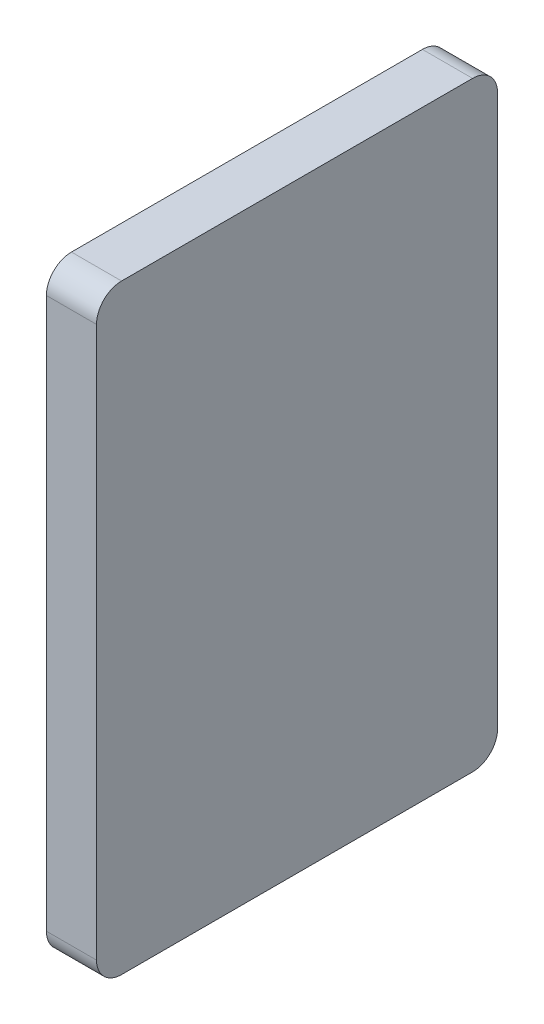
ISO-10303-21;
HEADER;
FILE_DESCRIPTION(('STEP AP214'),'2;1');
FILE_NAME('part.step','',(''),(''),'','','');
FILE_SCHEMA(('AUTOMOTIVE_DESIGN { 1 0 10303 214 1 1 1 1 }'));
ENDSEC;
DATA;
#1=APPLICATION_CONTEXT('core data for automotive mechanical design processes');
#2=APPLICATION_PROTOCOL_DEFINITION('international standard','automotive_design',2000,#1);
#3=PRODUCT_CONTEXT('',#1,'mechanical');
#4=PRODUCT('Part','Part','',(#3));
#5=PRODUCT_RELATED_PRODUCT_CATEGORY('part','',(#4));
#6=PRODUCT_DEFINITION_FORMATION('','',#4);
#7=PRODUCT_DEFINITION_CONTEXT('part definition',#1,'design');
#8=PRODUCT_DEFINITION('design','',#6,#7);
#9=PRODUCT_DEFINITION_SHAPE('','',#8);
#10=(LENGTH_UNIT() NAMED_UNIT(*) SI_UNIT(.MILLI.,.METRE.));
#11=(NAMED_UNIT(*) PLANE_ANGLE_UNIT() SI_UNIT($,.RADIAN.));
#12=(NAMED_UNIT(*) SI_UNIT($,.STERADIAN.) SOLID_ANGLE_UNIT());
#13=UNCERTAINTY_MEASURE_WITH_UNIT(LENGTH_MEASURE(1.E-05),#10,'distance_accuracy_value','');
#14=(GEOMETRIC_REPRESENTATION_CONTEXT(3) GLOBAL_UNCERTAINTY_ASSIGNED_CONTEXT((#13)) GLOBAL_UNIT_ASSIGNED_CONTEXT((#10,
#11,#12)) REPRESENTATION_CONTEXT('',''));
#15=CARTESIAN_POINT('',(0.,0.,0.));
#16=DIRECTION('',(0.,0.,1.));
#17=DIRECTION('',(1.,0.,0.));
#18=AXIS2_PLACEMENT_3D('',#15,#16,#17);
#19=CARTESIAN_POINT('',(124.127002291105,157.604574554,1057.012834154));
#20=DIRECTION('',(0.,0.,1.));
#21=DIRECTION('',(1.,0.,0.));
#22=AXIS2_PLACEMENT_3D('',#19,#20,#21);
#23=PLANE('',#22);
#24=DIRECTION('',(0.,1.,0.));
#25=VECTOR('',#24,1.);
#26=CARTESIAN_POINT('',(124.127002291105,157.604574554,1057.012834154));
#27=LINE('',#26,#25);
#28=CARTESIAN_POINT('',(124.127002291105,84.706574554,1057.012834154));
#29=VERTEX_POINT('',#28);
#30=CARTESIAN_POINT('',(124.127002291105,154.429574554,1057.012834154));
#31=VERTEX_POINT('',#30);
#32=EDGE_CURVE('E124',#29,#31,#27,.T.);
#33=ORIENTED_EDGE('',*,*,#32,.F.);
#34=DIRECTION('',(-1.,0.,0.));
#35=VECTOR('',#34,1.);
#36=CARTESIAN_POINT('',(124.127002291105,84.706574554,1057.012834154));
#37=LINE('',#36,#35);
#38=CARTESIAN_POINT('',(117.777002291105,84.706574554,1057.012834154));
#39=VERTEX_POINT('',#38);
#40=EDGE_CURVE('E109',#29,#39,#37,.T.);
#41=ORIENTED_EDGE('',*,*,#40,.T.);
#42=DIRECTION('',(0.,1.,0.));
#43=VECTOR('',#42,1.);
#44=CARTESIAN_POINT('',(117.777002291105,157.604574554,1057.012834154));
#45=LINE('',#44,#43);
#46=CARTESIAN_POINT('',(117.777002291105,154.429574554,1057.012834154));
#47=VERTEX_POINT('',#46);
#48=EDGE_CURVE('E121',#39,#47,#45,.T.);
#49=ORIENTED_EDGE('',*,*,#48,.T.);
#50=DIRECTION('',(-1.,0.,0.));
#51=VECTOR('',#50,1.);
#52=CARTESIAN_POINT('',(124.127002291105,154.429574554,1057.012834154));
#53=LINE('',#52,#51);
#54=EDGE_CURVE('E126',#47,#31,#53,.F.);
#55=ORIENTED_EDGE('',*,*,#54,.T.);
#56=EDGE_LOOP('',(#33,#41,#49,#55));
#57=FACE_BOUND('',#56,.T.);
#58=ADVANCED_FACE('F39',(#57),#23,.F.);
#59=CARTESIAN_POINT('',(124.127002291105,157.604574554,1057.012834154));
#60=DIRECTION('',(0.,-1.,0.));
#61=DIRECTION('',(0.,0.,-1.));
#62=AXIS2_PLACEMENT_3D('',#59,#60,#61);
#63=PLANE('',#62);
#64=DIRECTION('',(0.,0.,1.));
#65=VECTOR('',#64,1.);
#66=CARTESIAN_POINT('',(117.777002291105,157.604574554,1057.012834154));
#67=LINE('',#66,#65);
#68=CARTESIAN_POINT('',(117.777002291105,157.604574554,1060.187834154));
#69=VERTEX_POINT('',#68);
#70=CARTESIAN_POINT('',(117.777002291105,157.604574554,1104.637834154));
#71=VERTEX_POINT('',#70);
#72=EDGE_CURVE('E131',#69,#71,#67,.T.);
#73=ORIENTED_EDGE('',*,*,#72,.T.);
#74=DIRECTION('',(-1.,0.,0.));
#75=VECTOR('',#74,1.);
#76=CARTESIAN_POINT('',(124.127002291105,157.604574554,1104.637834154));
#77=LINE('',#76,#75);
#78=CARTESIAN_POINT('',(124.127002291105,157.604574554,1104.637834154));
#79=VERTEX_POINT('',#78);
#80=EDGE_CURVE('E11',#71,#79,#77,.F.);
#81=ORIENTED_EDGE('',*,*,#80,.T.);
#82=DIRECTION('',(0.,0.,1.));
#83=VECTOR('',#82,1.);
#84=CARTESIAN_POINT('',(124.127002291105,157.604574554,1057.012834154));
#85=LINE('',#84,#83);
#86=CARTESIAN_POINT('',(124.127002291105,157.604574554,1060.187834154));
#87=VERTEX_POINT('',#86);
#88=EDGE_CURVE('E166',#87,#79,#85,.T.);
#89=ORIENTED_EDGE('',*,*,#88,.F.);
#90=DIRECTION('',(-1.,0.,0.));
#91=VECTOR('',#90,1.);
#92=CARTESIAN_POINT('',(124.127002291105,157.604574554,1060.187834154));
#93=LINE('',#92,#91);
#94=EDGE_CURVE('E47',#87,#69,#93,.T.);
#95=ORIENTED_EDGE('',*,*,#94,.T.);
#96=EDGE_LOOP('',(#73,#81,#89,#95));
#97=FACE_BOUND('',#96,.T.);
#98=ADVANCED_FACE('F164',(#97),#63,.F.);
#99=CARTESIAN_POINT('',(124.127002291105,157.604574554,1107.812834154));
#100=DIRECTION('',(0.,0.,-1.));
#101=DIRECTION('',(-1.,0.,0.));
#102=AXIS2_PLACEMENT_3D('',#99,#100,#101);
#103=PLANE('',#102);
#104=DIRECTION('',(0.,-1.,0.));
#105=VECTOR('',#104,1.);
#106=CARTESIAN_POINT('',(124.127002291105,157.604574554,1107.812834154));
#107=LINE('',#106,#105);
#108=CARTESIAN_POINT('',(124.127002291105,154.429574554,1107.812834154));
#109=VERTEX_POINT('',#108);
#110=CARTESIAN_POINT('',(124.127002291105,84.706574554,1107.812834154));
#111=VERTEX_POINT('',#110);
#112=EDGE_CURVE('E174',#109,#111,#107,.T.);
#113=ORIENTED_EDGE('',*,*,#112,.F.);
#114=DIRECTION('',(-1.,0.,0.));
#115=VECTOR('',#114,1.);
#116=CARTESIAN_POINT('',(124.127002291105,154.429574554,1107.812834154));
#117=LINE('',#116,#115);
#118=CARTESIAN_POINT('',(117.777002291105,154.429574554,1107.812834154));
#119=VERTEX_POINT('',#118);
#120=EDGE_CURVE('E158',#109,#119,#117,.T.);
#121=ORIENTED_EDGE('',*,*,#120,.T.);
#122=DIRECTION('',(0.,-1.,0.));
#123=VECTOR('',#122,1.);
#124=CARTESIAN_POINT('',(117.777002291105,157.604574554,1107.812834154));
#125=LINE('',#124,#123);
#126=CARTESIAN_POINT('',(117.777002291105,84.706574554,1107.812834154));
#127=VERTEX_POINT('',#126);
#128=EDGE_CURVE('E134',#119,#127,#125,.T.);
#129=ORIENTED_EDGE('',*,*,#128,.T.);
#130=DIRECTION('',(-1.,0.,0.));
#131=VECTOR('',#130,1.);
#132=CARTESIAN_POINT('',(124.127002291105,84.706574554,1107.812834154));
#133=LINE('',#132,#131);
#134=EDGE_CURVE('E54',#127,#111,#133,.F.);
#135=ORIENTED_EDGE('',*,*,#134,.T.);
#136=EDGE_LOOP('',(#113,#121,#129,#135));
#137=FACE_BOUND('',#136,.T.);
#138=ADVANCED_FACE('F173',(#137),#103,.F.);
#139=CARTESIAN_POINT('',(124.127002291105,81.531574554,1057.012834154));
#140=DIRECTION('',(0.,1.,0.));
#141=DIRECTION('',(0.,0.,1.));
#142=AXIS2_PLACEMENT_3D('',#139,#140,#141);
#143=PLANE('',#142);
#144=DIRECTION('',(0.,0.,-1.));
#145=VECTOR('',#144,1.);
#146=CARTESIAN_POINT('',(117.777002291105,81.531574554,1057.012834154));
#147=LINE('',#146,#145);
#148=CARTESIAN_POINT('',(117.777002291105,81.531574554,1104.637834154));
#149=VERTEX_POINT('',#148);
#150=CARTESIAN_POINT('',(117.777002291105,81.531574554,1060.187834154));
#151=VERTEX_POINT('',#150);
#152=EDGE_CURVE('E141',#149,#151,#147,.T.);
#153=ORIENTED_EDGE('',*,*,#152,.T.);
#154=DIRECTION('',(-1.,0.,0.));
#155=VECTOR('',#154,1.);
#156=CARTESIAN_POINT('',(124.127002291105,81.531574554,1060.187834154));
#157=LINE('',#156,#155);
#158=CARTESIAN_POINT('',(124.127002291105,81.531574554,1060.187834154));
#159=VERTEX_POINT('',#158);
#160=EDGE_CURVE('E110',#151,#159,#157,.F.);
#161=ORIENTED_EDGE('',*,*,#160,.T.);
#162=DIRECTION('',(0.,0.,-1.));
#163=VECTOR('',#162,1.);
#164=CARTESIAN_POINT('',(124.127002291105,81.531574554,1057.012834154));
#165=LINE('',#164,#163);
#166=CARTESIAN_POINT('',(124.127002291105,81.531574554,1104.637834154));
#167=VERTEX_POINT('',#166);
#168=EDGE_CURVE('E137',#167,#159,#165,.T.);
#169=ORIENTED_EDGE('',*,*,#168,.F.);
#170=DIRECTION('',(-1.,0.,0.));
#171=VECTOR('',#170,1.);
#172=CARTESIAN_POINT('',(124.127002291105,81.531574554,1104.637834154));
#173=LINE('',#172,#171);
#174=EDGE_CURVE('E115',#167,#149,#173,.T.);
#175=ORIENTED_EDGE('',*,*,#174,.T.);
#176=EDGE_LOOP('',(#153,#161,#169,#175));
#177=FACE_BOUND('',#176,.T.);
#178=ADVANCED_FACE('F204',(#177),#143,.F.);
#179=CARTESIAN_POINT('',(124.127002291105,0.,0.));
#180=DIRECTION('',(-1.,0.,0.));
#181=DIRECTION('',(0.,0.,1.));
#182=AXIS2_PLACEMENT_3D('',#179,#180,#181);
#183=PLANE('',#182);
#184=ORIENTED_EDGE('',*,*,#168,.T.);
#185=CARTESIAN_POINT('',(124.127002291105,84.706574554,1060.187834154));
#186=DIRECTION('',(-1.,0.,0.));
#187=DIRECTION('',(0.,0.,1.));
#188=AXIS2_PLACEMENT_3D('',#185,#186,#187);
#189=CIRCLE('',#188,3.175);
#190=EDGE_CURVE('E155',#159,#29,#189,.F.);
#191=ORIENTED_EDGE('',*,*,#190,.T.);
#192=ORIENTED_EDGE('',*,*,#32,.T.);
#193=CARTESIAN_POINT('',(124.127002291105,154.429574554,1060.187834154));
#194=DIRECTION('',(-1.,0.,0.));
#195=DIRECTION('',(0.,0.,1.));
#196=AXIS2_PLACEMENT_3D('',#193,#194,#195);
#197=CIRCLE('',#196,3.175);
#198=EDGE_CURVE('E152',#31,#87,#197,.F.);
#199=ORIENTED_EDGE('',*,*,#198,.T.);
#200=ORIENTED_EDGE('',*,*,#88,.T.);
#201=CARTESIAN_POINT('',(124.127002291105,154.429574554,1104.637834154));
#202=DIRECTION('',(-1.,0.,0.));
#203=DIRECTION('',(0.,0.,1.));
#204=AXIS2_PLACEMENT_3D('',#201,#202,#203);
#205=CIRCLE('',#204,3.175);
#206=EDGE_CURVE('E61',#79,#109,#205,.F.);
#207=ORIENTED_EDGE('',*,*,#206,.T.);
#208=ORIENTED_EDGE('',*,*,#112,.T.);
#209=CARTESIAN_POINT('',(124.127002291105,84.706574554,1104.637834154));
#210=DIRECTION('',(-1.,0.,0.));
#211=DIRECTION('',(0.,0.,1.));
#212=AXIS2_PLACEMENT_3D('',#209,#210,#211);
#213=CIRCLE('',#212,3.175);
#214=EDGE_CURVE('E150',#111,#167,#213,.F.);
#215=ORIENTED_EDGE('',*,*,#214,.T.);
#216=EDGE_LOOP('',(#184,#191,#192,#199,#200,#207,#208,#215));
#217=FACE_BOUND('',#216,.T.);
#218=ADVANCED_FACE('F179',(#217),#183,.F.);
#219=CARTESIAN_POINT('',(117.777002291105,0.,0.));
#220=DIRECTION('',(-1.,0.,0.));
#221=DIRECTION('',(0.,0.,1.));
#222=AXIS2_PLACEMENT_3D('',#219,#220,#221);
#223=PLANE('',#222);
#224=ORIENTED_EDGE('',*,*,#48,.F.);
#225=CARTESIAN_POINT('',(117.777002291105,84.706574554,1060.187834154));
#226=DIRECTION('',(-1.,0.,0.));
#227=DIRECTION('',(0.,0.,1.));
#228=AXIS2_PLACEMENT_3D('',#225,#226,#227);
#229=CIRCLE('',#228,3.175);
#230=EDGE_CURVE('E105',#39,#151,#229,.T.);
#231=ORIENTED_EDGE('',*,*,#230,.T.);
#232=ORIENTED_EDGE('',*,*,#152,.F.);
#233=CARTESIAN_POINT('',(117.777002291105,84.706574554,1104.637834154));
#234=DIRECTION('',(-1.,0.,0.));
#235=DIRECTION('',(0.,0.,1.));
#236=AXIS2_PLACEMENT_3D('',#233,#234,#235);
#237=CIRCLE('',#236,3.175);
#238=EDGE_CURVE('E125',#149,#127,#237,.T.);
#239=ORIENTED_EDGE('',*,*,#238,.T.);
#240=ORIENTED_EDGE('',*,*,#128,.F.);
#241=CARTESIAN_POINT('',(117.777002291105,154.429574554,1104.637834154));
#242=DIRECTION('',(-1.,0.,0.));
#243=DIRECTION('',(0.,0.,1.));
#244=AXIS2_PLACEMENT_3D('',#241,#242,#243);
#245=CIRCLE('',#244,3.175);
#246=EDGE_CURVE('E116',#119,#71,#245,.T.);
#247=ORIENTED_EDGE('',*,*,#246,.T.);
#248=ORIENTED_EDGE('',*,*,#72,.F.);
#249=CARTESIAN_POINT('',(117.777002291105,154.429574554,1060.187834154));
#250=DIRECTION('',(-1.,0.,0.));
#251=DIRECTION('',(0.,0.,1.));
#252=AXIS2_PLACEMENT_3D('',#249,#250,#251);
#253=CIRCLE('',#252,3.175);
#254=EDGE_CURVE('E130',#69,#47,#253,.T.);
#255=ORIENTED_EDGE('',*,*,#254,.T.);
#256=EDGE_LOOP('',(#224,#231,#232,#239,#240,#247,#248,#255));
#257=FACE_BOUND('',#256,.T.);
#258=ADVANCED_FACE('F128',(#257),#223,.T.);
#259=CARTESIAN_POINT('',(124.127002291105,84.706574554,1060.187834154));
#260=DIRECTION('',(-1.,0.,0.));
#261=DIRECTION('',(0.,0.,1.));
#262=AXIS2_PLACEMENT_3D('',#259,#260,#261);
#263=CYLINDRICAL_SURFACE('',#262,3.175);
#264=ORIENTED_EDGE('',*,*,#190,.F.);
#265=ORIENTED_EDGE('',*,*,#160,.F.);
#266=ORIENTED_EDGE('',*,*,#230,.F.);
#267=ORIENTED_EDGE('',*,*,#40,.F.);
#268=EDGE_LOOP('',(#264,#265,#266,#267));
#269=FACE_BOUND('',#268,.T.);
#270=ADVANCED_FACE('F108',(#269),#263,.T.);
#271=CARTESIAN_POINT('',(124.127002291105,154.429574554,1104.637834154));
#272=DIRECTION('',(-1.,0.,0.));
#273=DIRECTION('',(0.,0.,1.));
#274=AXIS2_PLACEMENT_3D('',#271,#272,#273);
#275=CYLINDRICAL_SURFACE('',#274,3.175);
#276=ORIENTED_EDGE('',*,*,#206,.F.);
#277=ORIENTED_EDGE('',*,*,#80,.F.);
#278=ORIENTED_EDGE('',*,*,#246,.F.);
#279=ORIENTED_EDGE('',*,*,#120,.F.);
#280=EDGE_LOOP('',(#276,#277,#278,#279));
#281=FACE_BOUND('',#280,.T.);
#282=ADVANCED_FACE('F172',(#281),#275,.T.);
#283=CARTESIAN_POINT('',(124.127002291105,154.429574554,1060.187834154));
#284=DIRECTION('',(-1.,0.,0.));
#285=DIRECTION('',(0.,0.,1.));
#286=AXIS2_PLACEMENT_3D('',#283,#284,#285);
#287=CYLINDRICAL_SURFACE('',#286,3.175);
#288=ORIENTED_EDGE('',*,*,#198,.F.);
#289=ORIENTED_EDGE('',*,*,#54,.F.);
#290=ORIENTED_EDGE('',*,*,#254,.F.);
#291=ORIENTED_EDGE('',*,*,#94,.F.);
#292=EDGE_LOOP('',(#288,#289,#290,#291));
#293=FACE_BOUND('',#292,.T.);
#294=ADVANCED_FACE('F180',(#293),#287,.T.);
#295=CARTESIAN_POINT('',(124.127002291105,84.706574554,1104.637834154));
#296=DIRECTION('',(-1.,0.,0.));
#297=DIRECTION('',(0.,0.,1.));
#298=AXIS2_PLACEMENT_3D('',#295,#296,#297);
#299=CYLINDRICAL_SURFACE('',#298,3.175);
#300=ORIENTED_EDGE('',*,*,#214,.F.);
#301=ORIENTED_EDGE('',*,*,#134,.F.);
#302=ORIENTED_EDGE('',*,*,#238,.F.);
#303=ORIENTED_EDGE('',*,*,#174,.F.);
#304=EDGE_LOOP('',(#300,#301,#302,#303));
#305=FACE_BOUND('',#304,.T.);
#306=ADVANCED_FACE('F41',(#305),#299,.T.);
#307=CLOSED_SHELL('',(#58,#98,#138,#178,#218,#258,#270,#282,#294,#306));
#308=MANIFOLD_SOLID_BREP('B2',#307);
#309=ADVANCED_BREP_SHAPE_REPRESENTATION('',(#18,#308),#14);
#310=SHAPE_DEFINITION_REPRESENTATION(#9,#309);
ENDSEC;
END-ISO-10303-21;
